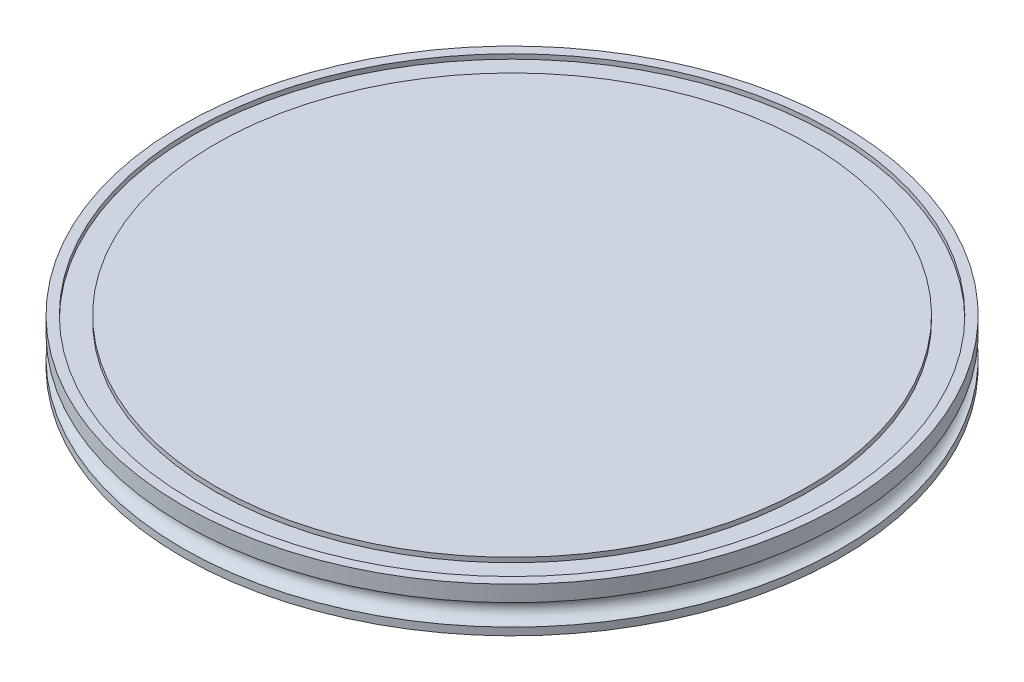
ISO-10303-21;
HEADER;
FILE_DESCRIPTION(('STEP AP214'),'2;1');
FILE_NAME('part.step','',(''),(''),'','','');
FILE_SCHEMA(('AUTOMOTIVE_DESIGN { 1 0 10303 214 1 1 1 1 }'));
ENDSEC;
DATA;
#1=APPLICATION_CONTEXT('core data for automotive mechanical design processes');
#2=APPLICATION_PROTOCOL_DEFINITION('international standard','automotive_design',2000,#1);
#3=PRODUCT_CONTEXT('',#1,'mechanical');
#4=PRODUCT('Part','Part','',(#3));
#5=PRODUCT_RELATED_PRODUCT_CATEGORY('part','',(#4));
#6=PRODUCT_DEFINITION_FORMATION('','',#4);
#7=PRODUCT_DEFINITION_CONTEXT('part definition',#1,'design');
#8=PRODUCT_DEFINITION('design','',#6,#7);
#9=PRODUCT_DEFINITION_SHAPE('','',#8);
#10=(LENGTH_UNIT() NAMED_UNIT(*) SI_UNIT(.MILLI.,.METRE.));
#11=(NAMED_UNIT(*) PLANE_ANGLE_UNIT() SI_UNIT($,.RADIAN.));
#12=(NAMED_UNIT(*) SI_UNIT($,.STERADIAN.) SOLID_ANGLE_UNIT());
#13=UNCERTAINTY_MEASURE_WITH_UNIT(LENGTH_MEASURE(1.E-05),#10,'distance_accuracy_value','');
#14=(GEOMETRIC_REPRESENTATION_CONTEXT(3) GLOBAL_UNCERTAINTY_ASSIGNED_CONTEXT((#13)) GLOBAL_UNIT_ASSIGNED_CONTEXT((#10,
#11,#12)) REPRESENTATION_CONTEXT('',''));
#15=CARTESIAN_POINT('',(0.,0.,0.));
#16=DIRECTION('',(0.,0.,1.));
#17=DIRECTION('',(1.,0.,0.));
#18=AXIS2_PLACEMENT_3D('',#15,#16,#17);
#19=CARTESIAN_POINT('',(0.,4.8895,0.));
#20=DIRECTION('',(0.,1.,0.));
#21=DIRECTION('',(0.,0.,1.));
#22=AXIS2_PLACEMENT_3D('',#19,#20,#21);
#23=TOROIDAL_SURFACE('',#22,88.9,2.8575);
#24=CARTESIAN_POINT('',(0.,2.032,0.));
#25=DIRECTION('',(0.,1.,0.));
#26=DIRECTION('',(0.,0.,1.));
#27=AXIS2_PLACEMENT_3D('',#24,#25,#26);
#28=CIRCLE('',#27,88.9);
#29=CARTESIAN_POINT('',(0.,2.032,88.9));
#30=VERTEX_POINT('',#29);
#31=EDGE_CURVE('E75',#30,#30,#28,.T.);
#32=ORIENTED_EDGE('',*,*,#31,.T.);
#33=EDGE_LOOP('',(#32));
#34=FACE_BOUND('',#33,.T.);
#35=CARTESIAN_POINT('',(0.,7.747,0.));
#36=DIRECTION('',(0.,1.,0.));
#37=DIRECTION('',(0.,0.,1.));
#38=AXIS2_PLACEMENT_3D('',#35,#36,#37);
#39=CIRCLE('',#38,88.9);
#40=CARTESIAN_POINT('',(0.,7.747,88.9));
#41=VERTEX_POINT('',#40);
#42=EDGE_CURVE('E10',#41,#41,#39,.T.);
#43=ORIENTED_EDGE('',*,*,#42,.F.);
#44=EDGE_LOOP('',(#43));
#45=FACE_BOUND('',#44,.T.);
#46=ADVANCED_FACE('F35',(#34,#45),#23,.F.);
#47=CARTESIAN_POINT('',(0.,28.206974459725,0.));
#48=DIRECTION('',(0.,1.,0.));
#49=DIRECTION('',(0.,0.,1.));
#50=AXIS2_PLACEMENT_3D('',#47,#48,#49);
#51=CYLINDRICAL_SURFACE('',#50,88.9);
#52=ORIENTED_EDGE('',*,*,#42,.T.);
#53=EDGE_LOOP('',(#52));
#54=FACE_BOUND('',#53,.T.);
#55=CARTESIAN_POINT('',(0.,12.065,0.));
#56=DIRECTION('',(0.,1.,0.));
#57=DIRECTION('',(0.,0.,1.));
#58=AXIS2_PLACEMENT_3D('',#55,#56,#57);
#59=CIRCLE('',#58,88.9);
#60=CARTESIAN_POINT('',(0.,12.065,88.9));
#61=VERTEX_POINT('',#60);
#62=EDGE_CURVE('E41',#61,#61,#59,.T.);
#63=ORIENTED_EDGE('',*,*,#62,.F.);
#64=EDGE_LOOP('',(#63));
#65=FACE_BOUND('',#64,.T.);
#66=ADVANCED_FACE('F94',(#54,#65),#51,.T.);
#67=CARTESIAN_POINT('',(0.,12.065,0.));
#68=DIRECTION('',(0.,-1.,0.));
#69=DIRECTION('',(0.,0.,-1.));
#70=AXIS2_PLACEMENT_3D('',#67,#68,#69);
#71=PLANE('',#70);
#72=CARTESIAN_POINT('',(0.,12.065,0.));
#73=DIRECTION('',(0.,1.,0.));
#74=DIRECTION('',(0.,0.,1.));
#75=AXIS2_PLACEMENT_3D('',#72,#73,#74);
#76=CIRCLE('',#75,86.36);
#77=CARTESIAN_POINT('',(0.,12.065,86.36));
#78=VERTEX_POINT('',#77);
#79=EDGE_CURVE('E45',#78,#78,#76,.T.);
#80=ORIENTED_EDGE('',*,*,#79,.F.);
#81=EDGE_LOOP('',(#80));
#82=FACE_BOUND('',#81,.T.);
#83=ORIENTED_EDGE('',*,*,#62,.T.);
#84=EDGE_LOOP('',(#83));
#85=FACE_BOUND('',#84,.T.);
#86=ADVANCED_FACE('F98',(#82,#85),#71,.F.);
#87=CARTESIAN_POINT('',(0.,28.206974459725,0.));
#88=DIRECTION('',(0.,1.,0.));
#89=DIRECTION('',(0.,0.,1.));
#90=AXIS2_PLACEMENT_3D('',#87,#88,#89);
#91=CYLINDRICAL_SURFACE('',#90,86.36);
#92=CARTESIAN_POINT('',(0.,10.795,0.));
#93=DIRECTION('',(0.,1.,0.));
#94=DIRECTION('',(0.,0.,1.));
#95=AXIS2_PLACEMENT_3D('',#92,#93,#94);
#96=CIRCLE('',#95,86.36);
#97=CARTESIAN_POINT('',(0.,10.795,86.36));
#98=VERTEX_POINT('',#97);
#99=EDGE_CURVE('E49',#98,#98,#96,.T.);
#100=ORIENTED_EDGE('',*,*,#99,.F.);
#101=EDGE_LOOP('',(#100));
#102=FACE_BOUND('',#101,.T.);
#103=ORIENTED_EDGE('',*,*,#79,.T.);
#104=EDGE_LOOP('',(#103));
#105=FACE_BOUND('',#104,.T.);
#106=ADVANCED_FACE('F102',(#102,#105),#91,.F.);
#107=CARTESIAN_POINT('',(0.,10.795,0.));
#108=DIRECTION('',(0.,-1.,0.));
#109=DIRECTION('',(0.,0.,-1.));
#110=AXIS2_PLACEMENT_3D('',#107,#108,#109);
#111=PLANE('',#110);
#112=CARTESIAN_POINT('',(0.,10.795,0.));
#113=DIRECTION('',(0.,1.,0.));
#114=DIRECTION('',(0.,0.,1.));
#115=AXIS2_PLACEMENT_3D('',#112,#113,#114);
#116=CIRCLE('',#115,80.01);
#117=CARTESIAN_POINT('',(0.,10.795,80.01));
#118=VERTEX_POINT('',#117);
#119=EDGE_CURVE('E54',#118,#118,#116,.T.);
#120=ORIENTED_EDGE('',*,*,#119,.F.);
#121=EDGE_LOOP('',(#120));
#122=FACE_BOUND('',#121,.T.);
#123=ORIENTED_EDGE('',*,*,#99,.T.);
#124=EDGE_LOOP('',(#123));
#125=FACE_BOUND('',#124,.T.);
#126=ADVANCED_FACE('F109',(#122,#125),#111,.F.);
#127=CARTESIAN_POINT('',(0.,28.206974459725,0.));
#128=DIRECTION('',(0.,1.,0.));
#129=DIRECTION('',(0.,0.,1.));
#130=AXIS2_PLACEMENT_3D('',#127,#128,#129);
#131=CYLINDRICAL_SURFACE('',#130,80.01);
#132=CARTESIAN_POINT('',(0.,12.065,0.));
#133=DIRECTION('',(0.,1.,0.));
#134=DIRECTION('',(0.,0.,1.));
#135=AXIS2_PLACEMENT_3D('',#132,#133,#134);
#136=CIRCLE('',#135,80.01);
#137=CARTESIAN_POINT('',(0.,12.065,80.01));
#138=VERTEX_POINT('',#137);
#139=EDGE_CURVE('E57',#138,#138,#136,.T.);
#140=ORIENTED_EDGE('',*,*,#139,.F.);
#141=EDGE_LOOP('',(#140));
#142=FACE_BOUND('',#141,.T.);
#143=ORIENTED_EDGE('',*,*,#119,.T.);
#144=EDGE_LOOP('',(#143));
#145=FACE_BOUND('',#144,.T.);
#146=ADVANCED_FACE('F113',(#142,#145),#131,.T.);
#147=CARTESIAN_POINT('',(0.,12.065,0.));
#148=DIRECTION('',(0.,1.,0.));
#149=DIRECTION('',(0.,0.,1.));
#150=AXIS2_PLACEMENT_3D('',#147,#148,#149);
#151=PLANE('',#150);
#152=ORIENTED_EDGE('',*,*,#139,.T.);
#153=EDGE_LOOP('',(#152));
#154=FACE_BOUND('',#153,.T.);
#155=ADVANCED_FACE('F117',(#154),#151,.T.);
#156=CARTESIAN_POINT('',(0.,0.,0.));
#157=DIRECTION('',(0.,-1.,0.));
#158=DIRECTION('',(0.,0.,-1.));
#159=AXIS2_PLACEMENT_3D('',#156,#157,#158);
#160=PLANE('',#159);
#161=CARTESIAN_POINT('',(0.,0.,0.));
#162=DIRECTION('',(0.,1.,0.));
#163=DIRECTION('',(0.,0.,1.));
#164=AXIS2_PLACEMENT_3D('',#161,#162,#163);
#165=CIRCLE('',#164,69.85);
#166=CARTESIAN_POINT('',(0.,0.,69.85));
#167=VERTEX_POINT('',#166);
#168=EDGE_CURVE('E60',#167,#167,#165,.T.);
#169=ORIENTED_EDGE('',*,*,#168,.F.);
#170=EDGE_LOOP('',(#169));
#171=FACE_BOUND('',#170,.T.);
#172=ADVANCED_FACE('F120',(#171),#160,.T.);
#173=CARTESIAN_POINT('',(0.,28.206974459725,0.));
#174=DIRECTION('',(0.,1.,0.));
#175=DIRECTION('',(0.,0.,1.));
#176=AXIS2_PLACEMENT_3D('',#173,#174,#175);
#177=CYLINDRICAL_SURFACE('',#176,69.85);
#178=ORIENTED_EDGE('',*,*,#168,.T.);
#179=EDGE_LOOP('',(#178));
#180=FACE_BOUND('',#179,.T.);
#181=CARTESIAN_POINT('',(0.,2.54,0.));
#182=DIRECTION('',(0.,1.,0.));
#183=DIRECTION('',(0.,0.,1.));
#184=AXIS2_PLACEMENT_3D('',#181,#182,#183);
#185=CIRCLE('',#184,69.85);
#186=CARTESIAN_POINT('',(0.,2.54,69.85));
#187=VERTEX_POINT('',#186);
#188=EDGE_CURVE('E63',#187,#187,#185,.T.);
#189=ORIENTED_EDGE('',*,*,#188,.F.);
#190=EDGE_LOOP('',(#189));
#191=FACE_BOUND('',#190,.T.);
#192=ADVANCED_FACE('F124',(#180,#191),#177,.T.);
#193=CARTESIAN_POINT('',(0.,2.54,0.));
#194=DIRECTION('',(0.,-1.,0.));
#195=DIRECTION('',(0.,0.,-1.));
#196=AXIS2_PLACEMENT_3D('',#193,#194,#195);
#197=PLANE('',#196);
#198=ORIENTED_EDGE('',*,*,#188,.T.);
#199=EDGE_LOOP('',(#198));
#200=FACE_BOUND('',#199,.T.);
#201=CARTESIAN_POINT('',(0.,2.54,0.));
#202=DIRECTION('',(0.,1.,0.));
#203=DIRECTION('',(0.,0.,1.));
#204=AXIS2_PLACEMENT_3D('',#201,#202,#203);
#205=CIRCLE('',#204,76.2);
#206=CARTESIAN_POINT('',(0.,2.54,76.2));
#207=VERTEX_POINT('',#206);
#208=EDGE_CURVE('E66',#207,#207,#205,.T.);
#209=ORIENTED_EDGE('',*,*,#208,.F.);
#210=EDGE_LOOP('',(#209));
#211=FACE_BOUND('',#210,.T.);
#212=ADVANCED_FACE('F128',(#200,#211),#197,.T.);
#213=CARTESIAN_POINT('',(0.,28.206974459725,0.));
#214=DIRECTION('',(0.,1.,0.));
#215=DIRECTION('',(0.,0.,1.));
#216=AXIS2_PLACEMENT_3D('',#213,#214,#215);
#217=CYLINDRICAL_SURFACE('',#216,76.2);
#218=ORIENTED_EDGE('',*,*,#208,.T.);
#219=EDGE_LOOP('',(#218));
#220=FACE_BOUND('',#219,.T.);
#221=CARTESIAN_POINT('',(0.,0.,0.));
#222=DIRECTION('',(0.,1.,0.));
#223=DIRECTION('',(0.,0.,1.));
#224=AXIS2_PLACEMENT_3D('',#221,#222,#223);
#225=CIRCLE('',#224,76.2);
#226=CARTESIAN_POINT('',(0.,0.,76.2));
#227=VERTEX_POINT('',#226);
#228=EDGE_CURVE('E69',#227,#227,#225,.T.);
#229=ORIENTED_EDGE('',*,*,#228,.F.);
#230=EDGE_LOOP('',(#229));
#231=FACE_BOUND('',#230,.T.);
#232=ADVANCED_FACE('F90',(#220,#231),#217,.F.);
#233=CARTESIAN_POINT('',(0.,0.,0.));
#234=DIRECTION('',(0.,-1.,0.));
#235=DIRECTION('',(0.,0.,-1.));
#236=AXIS2_PLACEMENT_3D('',#233,#234,#235);
#237=PLANE('',#236);
#238=ORIENTED_EDGE('',*,*,#228,.T.);
#239=EDGE_LOOP('',(#238));
#240=FACE_BOUND('',#239,.T.);
#241=CARTESIAN_POINT('',(0.,0.,0.));
#242=DIRECTION('',(0.,1.,0.));
#243=DIRECTION('',(0.,0.,1.));
#244=AXIS2_PLACEMENT_3D('',#241,#242,#243);
#245=CIRCLE('',#244,88.9);
#246=CARTESIAN_POINT('',(0.,0.,88.9));
#247=VERTEX_POINT('',#246);
#248=EDGE_CURVE('E72',#247,#247,#245,.T.);
#249=ORIENTED_EDGE('',*,*,#248,.F.);
#250=EDGE_LOOP('',(#249));
#251=FACE_BOUND('',#250,.T.);
#252=ADVANCED_FACE('F83',(#240,#251),#237,.T.);
#253=CARTESIAN_POINT('',(0.,28.206974459725,0.));
#254=DIRECTION('',(0.,1.,0.));
#255=DIRECTION('',(0.,0.,1.));
#256=AXIS2_PLACEMENT_3D('',#253,#254,#255);
#257=CYLINDRICAL_SURFACE('',#256,88.9);
#258=ORIENTED_EDGE('',*,*,#248,.T.);
#259=EDGE_LOOP('',(#258));
#260=FACE_BOUND('',#259,.T.);
#261=ORIENTED_EDGE('',*,*,#31,.F.);
#262=EDGE_LOOP('',(#261));
#263=FACE_BOUND('',#262,.T.);
#264=ADVANCED_FACE('F81',(#260,#263),#257,.T.);
#265=CLOSED_SHELL('',(#46,#66,#86,#106,#126,#146,#155,#172,#192,#212,#232,#252,#264));
#266=MANIFOLD_SOLID_BREP('B2',#265);
#267=ADVANCED_BREP_SHAPE_REPRESENTATION('',(#18,#266),#14);
#268=SHAPE_DEFINITION_REPRESENTATION(#9,#267);
ENDSEC;
END-ISO-10303-21;
